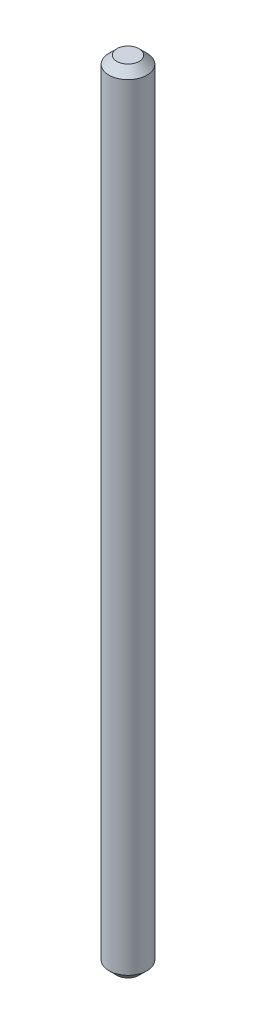
ISO-10303-21;
HEADER;
FILE_DESCRIPTION(('STEP AP214'),'2;1');
FILE_NAME('part.step','',(''),(''),'','','');
FILE_SCHEMA(('AUTOMOTIVE_DESIGN { 1 0 10303 214 1 1 1 1 }'));
ENDSEC;
DATA;
#1=APPLICATION_CONTEXT('core data for automotive mechanical design processes');
#2=APPLICATION_PROTOCOL_DEFINITION('international standard','automotive_design',2000,#1);
#3=PRODUCT_CONTEXT('',#1,'mechanical');
#4=PRODUCT('Part','Part','',(#3));
#5=PRODUCT_RELATED_PRODUCT_CATEGORY('part','',(#4));
#6=PRODUCT_DEFINITION_FORMATION('','',#4);
#7=PRODUCT_DEFINITION_CONTEXT('part definition',#1,'design');
#8=PRODUCT_DEFINITION('design','',#6,#7);
#9=PRODUCT_DEFINITION_SHAPE('','',#8);
#10=(LENGTH_UNIT() NAMED_UNIT(*) SI_UNIT(.MILLI.,.METRE.));
#11=(NAMED_UNIT(*) PLANE_ANGLE_UNIT() SI_UNIT($,.RADIAN.));
#12=(NAMED_UNIT(*) SI_UNIT($,.STERADIAN.) SOLID_ANGLE_UNIT());
#13=UNCERTAINTY_MEASURE_WITH_UNIT(LENGTH_MEASURE(1.E-05),#10,'distance_accuracy_value','');
#14=(GEOMETRIC_REPRESENTATION_CONTEXT(3) GLOBAL_UNCERTAINTY_ASSIGNED_CONTEXT((#13)) GLOBAL_UNIT_ASSIGNED_CONTEXT((#10,
#11,#12)) REPRESENTATION_CONTEXT('',''));
#15=CARTESIAN_POINT('',(0.,0.,0.));
#16=DIRECTION('',(0.,0.,1.));
#17=DIRECTION('',(1.,0.,0.));
#18=AXIS2_PLACEMENT_3D('',#15,#16,#17);
#19=CARTESIAN_POINT('',(0.,127.,0.));
#20=DIRECTION('',(0.,-1.,0.));
#21=DIRECTION('',(0.,0.,-1.));
#22=AXIS2_PLACEMENT_3D('',#19,#20,#21);
#23=CYLINDRICAL_SURFACE('',#22,3.04799999999999);
#24=CARTESIAN_POINT('',(0.,1.26999999999999,0.));
#25=DIRECTION('',(0.,1.,0.));
#26=DIRECTION('',(0.,0.,1.));
#27=AXIS2_PLACEMENT_3D('',#24,#25,#26);
#28=CIRCLE('',#27,3.04799999999999);
#29=CARTESIAN_POINT('',(0.,1.26999999999999,3.04799999999999));
#30=VERTEX_POINT('',#29);
#31=EDGE_CURVE('E53',#30,#30,#28,.T.);
#32=ORIENTED_EDGE('',*,*,#31,.T.);
#33=EDGE_LOOP('',(#32));
#34=FACE_BOUND('',#33,.T.);
#35=CARTESIAN_POINT('',(0.,125.73,0.));
#36=DIRECTION('',(0.,1.,0.));
#37=DIRECTION('',(0.,0.,1.));
#38=AXIS2_PLACEMENT_3D('',#35,#36,#37);
#39=CIRCLE('',#38,3.04799999999999);
#40=CARTESIAN_POINT('',(0.,125.73,3.04799999999999));
#41=VERTEX_POINT('',#40);
#42=EDGE_CURVE('E56',#41,#41,#39,.F.);
#43=ORIENTED_EDGE('',*,*,#42,.T.);
#44=EDGE_LOOP('',(#43));
#45=FACE_BOUND('',#44,.T.);
#46=ADVANCED_FACE('F44',(#34,#45),#23,.T.);
#47=CARTESIAN_POINT('',(0.,127.,0.));
#48=DIRECTION('',(0.,1.,0.));
#49=DIRECTION('',(0.,0.,1.));
#50=AXIS2_PLACEMENT_3D('',#47,#48,#49);
#51=PLANE('',#50);
#52=CARTESIAN_POINT('',(0.,127.,0.));
#53=DIRECTION('',(0.,1.,0.));
#54=DIRECTION('',(0.,0.,1.));
#55=AXIS2_PLACEMENT_3D('',#52,#53,#54);
#56=CIRCLE('',#55,1.77799999999999);
#57=CARTESIAN_POINT('',(0.,127.,1.77799999999999));
#58=VERTEX_POINT('',#57);
#59=EDGE_CURVE('E62',#58,#58,#56,.T.);
#60=ORIENTED_EDGE('',*,*,#59,.T.);
#61=EDGE_LOOP('',(#60));
#62=FACE_BOUND('',#61,.T.);
#63=ADVANCED_FACE('F72',(#62),#51,.T.);
#64=CARTESIAN_POINT('',(0.,0.,0.));
#65=DIRECTION('',(0.,1.,0.));
#66=DIRECTION('',(0.,0.,1.));
#67=AXIS2_PLACEMENT_3D('',#64,#65,#66);
#68=PLANE('',#67);
#69=CARTESIAN_POINT('',(0.,0.,0.));
#70=DIRECTION('',(0.,1.,0.));
#71=DIRECTION('',(0.,0.,1.));
#72=AXIS2_PLACEMENT_3D('',#69,#70,#71);
#73=CIRCLE('',#72,1.77799999999999);
#74=CARTESIAN_POINT('',(0.,0.,1.77799999999999));
#75=VERTEX_POINT('',#74);
#76=EDGE_CURVE('E10',#75,#75,#73,.F.);
#77=ORIENTED_EDGE('',*,*,#76,.T.);
#78=EDGE_LOOP('',(#77));
#79=FACE_BOUND('',#78,.T.);
#80=ADVANCED_FACE('F73',(#79),#68,.F.);
#81=CARTESIAN_POINT('',(0.,127.,0.));
#82=DIRECTION('',(0.,-1.,0.));
#83=DIRECTION('',(0.,0.,-1.));
#84=AXIS2_PLACEMENT_3D('',#81,#82,#83);
#85=CONICAL_SURFACE('',#84,1.77799999999999,0.785398163397453);
#86=ORIENTED_EDGE('',*,*,#42,.F.);
#87=EDGE_LOOP('',(#86));
#88=FACE_BOUND('',#87,.T.);
#89=ORIENTED_EDGE('',*,*,#59,.F.);
#90=EDGE_LOOP('',(#89));
#91=FACE_BOUND('',#90,.T.);
#92=ADVANCED_FACE('F71',(#88,#91),#85,.T.);
#93=CARTESIAN_POINT('',(0.,1.26999999999999,0.));
#94=DIRECTION('',(0.,1.,0.));
#95=DIRECTION('',(0.,0.,1.));
#96=AXIS2_PLACEMENT_3D('',#93,#94,#95);
#97=CONICAL_SURFACE('',#96,3.04799999999999,0.785398163397453);
#98=ORIENTED_EDGE('',*,*,#76,.F.);
#99=EDGE_LOOP('',(#98));
#100=FACE_BOUND('',#99,.T.);
#101=ORIENTED_EDGE('',*,*,#31,.F.);
#102=EDGE_LOOP('',(#101));
#103=FACE_BOUND('',#102,.T.);
#104=ADVANCED_FACE('F48',(#100,#103),#97,.T.);
#105=CLOSED_SHELL('',(#46,#63,#80,#92,#104));
#106=MANIFOLD_SOLID_BREP('B2',#105);
#107=ADVANCED_BREP_SHAPE_REPRESENTATION('',(#18,#106),#14);
#108=SHAPE_DEFINITION_REPRESENTATION(#9,#107);
ENDSEC;
END-ISO-10303-21;
